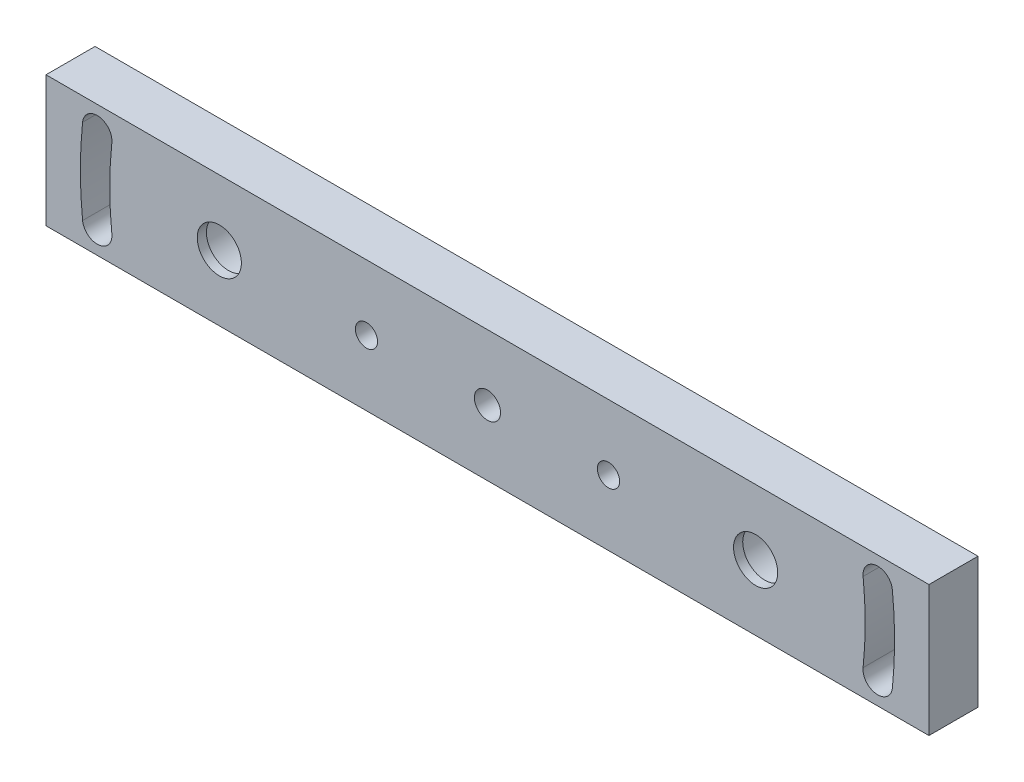
ISO-10303-21;
HEADER;
FILE_DESCRIPTION(('STEP AP214'),'2;1');
FILE_NAME('part.step','',(''),(''),'','','');
FILE_SCHEMA(('AUTOMOTIVE_DESIGN { 1 0 10303 214 1 1 1 1 }'));
ENDSEC;
DATA;
#1=APPLICATION_CONTEXT('core data for automotive mechanical design processes');
#2=APPLICATION_PROTOCOL_DEFINITION('international standard','automotive_design',2000,#1);
#3=PRODUCT_CONTEXT('',#1,'mechanical');
#4=PRODUCT('Part','Part','',(#3));
#5=PRODUCT_RELATED_PRODUCT_CATEGORY('part','',(#4));
#6=PRODUCT_DEFINITION_FORMATION('','',#4);
#7=PRODUCT_DEFINITION_CONTEXT('part definition',#1,'design');
#8=PRODUCT_DEFINITION('design','',#6,#7);
#9=PRODUCT_DEFINITION_SHAPE('','',#8);
#10=(LENGTH_UNIT() NAMED_UNIT(*) SI_UNIT(.MILLI.,.METRE.));
#11=(NAMED_UNIT(*) PLANE_ANGLE_UNIT() SI_UNIT($,.RADIAN.));
#12=(NAMED_UNIT(*) SI_UNIT($,.STERADIAN.) SOLID_ANGLE_UNIT());
#13=UNCERTAINTY_MEASURE_WITH_UNIT(LENGTH_MEASURE(1.E-05),#10,'distance_accuracy_value','');
#14=(GEOMETRIC_REPRESENTATION_CONTEXT(3) GLOBAL_UNCERTAINTY_ASSIGNED_CONTEXT((#13)) GLOBAL_UNIT_ASSIGNED_CONTEXT((#10,
#11,#12)) REPRESENTATION_CONTEXT('',''));
#15=CARTESIAN_POINT('',(0.,0.,0.));
#16=DIRECTION('',(0.,0.,1.));
#17=DIRECTION('',(1.,0.,0.));
#18=AXIS2_PLACEMENT_3D('',#15,#16,#17);
#19=CARTESIAN_POINT('',(0.,0.,15.));
#20=DIRECTION('',(0.,0.,-1.));
#21=DIRECTION('',(-1.,0.,0.));
#22=AXIS2_PLACEMENT_3D('',#19,#20,#21);
#23=PLANE('',#22);
#24=CARTESIAN_POINT('',(0.,0.,15.));
#25=DIRECTION('',(0.,0.,-1.));
#26=DIRECTION('',(-1.,0.,0.));
#27=AXIS2_PLACEMENT_3D('',#24,#25,#26);
#28=CIRCLE('',#27,4.00000000000001);
#29=CARTESIAN_POINT('',(-4.00000000000001,0.,15.));
#30=VERTEX_POINT('',#29);
#31=EDGE_CURVE('E486',#30,#30,#28,.T.);
#32=ORIENTED_EDGE('',*,*,#31,.T.);
#33=EDGE_LOOP('',(#32));
#34=FACE_BOUND('',#33,.T.);
#35=CARTESIAN_POINT('',(-37.,0.,15.));
#36=DIRECTION('',(0.,0.,1.));
#37=DIRECTION('',(1.,0.,0.));
#38=AXIS2_PLACEMENT_3D('',#35,#36,#37);
#39=CIRCLE('',#38,3.39999999999999);
#40=CARTESIAN_POINT('',(-33.6,0.,15.));
#41=VERTEX_POINT('',#40);
#42=EDGE_CURVE('E491',#41,#41,#39,.T.);
#43=ORIENTED_EDGE('',*,*,#42,.F.);
#44=EDGE_LOOP('',(#43));
#45=FACE_BOUND('',#44,.T.);
#46=DIRECTION('',(0.,1.,0.));
#47=VECTOR('',#46,1.);
#48=CARTESIAN_POINT('',(135.,-20.,15.));
#49=LINE('',#48,#47);
#50=CARTESIAN_POINT('',(135.,-20.,15.));
#51=VERTEX_POINT('',#50);
#52=CARTESIAN_POINT('',(135.,20.,15.));
#53=VERTEX_POINT('',#52);
#54=EDGE_CURVE('E222',#51,#53,#49,.T.);
#55=ORIENTED_EDGE('',*,*,#54,.T.);
#56=DIRECTION('',(-1.,0.,0.));
#57=VECTOR('',#56,1.);
#58=CARTESIAN_POINT('',(-135.,20.,15.));
#59=LINE('',#58,#57);
#60=CARTESIAN_POINT('',(-135.,20.,15.));
#61=VERTEX_POINT('',#60);
#62=EDGE_CURVE('E225',#53,#61,#59,.T.);
#63=ORIENTED_EDGE('',*,*,#62,.T.);
#64=DIRECTION('',(0.,-1.,0.));
#65=VECTOR('',#64,1.);
#66=CARTESIAN_POINT('',(-135.,-20.,15.));
#67=LINE('',#66,#65);
#68=CARTESIAN_POINT('',(-135.,-20.,15.));
#69=VERTEX_POINT('',#68);
#70=EDGE_CURVE('E228',#61,#69,#67,.T.);
#71=ORIENTED_EDGE('',*,*,#70,.T.);
#72=DIRECTION('',(1.,0.,0.));
#73=VECTOR('',#72,1.);
#74=CARTESIAN_POINT('',(-135.,-20.,15.));
#75=LINE('',#74,#73);
#76=EDGE_CURVE('E230',#69,#51,#75,.T.);
#77=ORIENTED_EDGE('',*,*,#76,.T.);
#78=EDGE_LOOP('',(#55,#63,#71,#77));
#79=FACE_BOUND('',#78,.T.);
#80=CARTESIAN_POINT('',(-82.,0.,15.));
#81=DIRECTION('',(0.,0.,-1.));
#82=DIRECTION('',(-1.,0.,0.));
#83=AXIS2_PLACEMENT_3D('',#80,#81,#82);
#84=CIRCLE('',#83,6.74999999999999);
#85=CARTESIAN_POINT('',(-88.75,0.,15.));
#86=VERTEX_POINT('',#85);
#87=EDGE_CURVE('E218',#86,#86,#84,.T.);
#88=ORIENTED_EDGE('',*,*,#87,.T.);
#89=EDGE_LOOP('',(#88));
#90=FACE_BOUND('',#89,.T.);
#91=CARTESIAN_POINT('',(82.,0.,15.));
#92=DIRECTION('',(0.,0.,-1.));
#93=DIRECTION('',(-1.,0.,0.));
#94=AXIS2_PLACEMENT_3D('',#91,#92,#93);
#95=CIRCLE('',#94,6.74999999999999);
#96=CARTESIAN_POINT('',(75.25,0.,15.));
#97=VERTEX_POINT('',#96);
#98=EDGE_CURVE('E206',#97,#97,#95,.T.);
#99=ORIENTED_EDGE('',*,*,#98,.T.);
#100=EDGE_LOOP('',(#99));
#101=FACE_BOUND('',#100,.T.);
#102=CARTESIAN_POINT('',(0.,0.,15.));
#103=DIRECTION('',(0.,0.,1.));
#104=DIRECTION('',(1.,0.,0.));
#105=AXIS2_PLACEMENT_3D('',#102,#103,#104);
#106=CIRCLE('',#105,124.5);
#107=CARTESIAN_POINT('',(123.81797597335,-13.013793676823,15.));
#108=VERTEX_POINT('',#107);
#109=CARTESIAN_POINT('',(123.81797597335,13.0137936768229,15.));
#110=VERTEX_POINT('',#109);
#111=EDGE_CURVE('E181',#108,#110,#106,.T.);
#112=ORIENTED_EDGE('',*,*,#111,.F.);
#113=CARTESIAN_POINT('',(119.342627444193,-12.5434155921184,15.));
#114=DIRECTION('',(0.,0.,1.));
#115=DIRECTION('',(1.,0.,0.));
#116=AXIS2_PLACEMENT_3D('',#113,#114,#115);
#117=CIRCLE('',#116,4.50000000000001);
#118=CARTESIAN_POINT('',(114.867278915036,-12.0730375074141,15.));
#119=VERTEX_POINT('',#118);
#120=EDGE_CURVE('E162',#119,#108,#117,.T.);
#121=ORIENTED_EDGE('',*,*,#120,.F.);
#122=CARTESIAN_POINT('',(0.,0.,15.));
#123=DIRECTION('',(0.,0.,-1.));
#124=DIRECTION('',(1.,0.,0.));
#125=AXIS2_PLACEMENT_3D('',#122,#123,#124);
#126=CIRCLE('',#125,115.5);
#127=CARTESIAN_POINT('',(114.867278915036,12.073037507414,15.));
#128=VERTEX_POINT('',#127);
#129=EDGE_CURVE('E170',#128,#119,#126,.T.);
#130=ORIENTED_EDGE('',*,*,#129,.F.);
#131=CARTESIAN_POINT('',(119.342627444193,12.5434155921184,15.));
#132=DIRECTION('',(0.,0.,1.));
#133=DIRECTION('',(1.,0.,0.));
#134=AXIS2_PLACEMENT_3D('',#131,#132,#133);
#135=CIRCLE('',#134,4.50000000000001);
#136=EDGE_CURVE('E184',#110,#128,#135,.T.);
#137=ORIENTED_EDGE('',*,*,#136,.F.);
#138=EDGE_LOOP('',(#112,#121,#130,#137));
#139=FACE_BOUND('',#138,.T.);
#140=CARTESIAN_POINT('',(-119.342627444193,12.5434155921184,15.));
#141=DIRECTION('',(0.,0.,1.));
#142=DIRECTION('',(-1.,0.,0.));
#143=AXIS2_PLACEMENT_3D('',#140,#141,#142);
#144=CIRCLE('',#143,4.50000000000001);
#145=CARTESIAN_POINT('',(-114.867278915036,12.073037507414,15.));
#146=VERTEX_POINT('',#145);
#147=CARTESIAN_POINT('',(-123.81797597335,13.0137936768229,15.));
#148=VERTEX_POINT('',#147);
#149=EDGE_CURVE('E156',#146,#148,#144,.T.);
#150=ORIENTED_EDGE('',*,*,#149,.F.);
#151=CARTESIAN_POINT('',(0.,0.,15.));
#152=DIRECTION('',(0.,0.,-1.));
#153=DIRECTION('',(-1.,0.,0.));
#154=AXIS2_PLACEMENT_3D('',#151,#152,#153);
#155=CIRCLE('',#154,115.5);
#156=CARTESIAN_POINT('',(-114.867278915036,-12.073037507414,15.));
#157=VERTEX_POINT('',#156);
#158=EDGE_CURVE('E52',#157,#146,#155,.T.);
#159=ORIENTED_EDGE('',*,*,#158,.F.);
#160=CARTESIAN_POINT('',(-119.342627444193,-12.5434155921184,15.));
#161=DIRECTION('',(0.,0.,1.));
#162=DIRECTION('',(-1.,0.,0.));
#163=AXIS2_PLACEMENT_3D('',#160,#161,#162);
#164=CIRCLE('',#163,4.50000000000001);
#165=CARTESIAN_POINT('',(-123.81797597335,-13.0137936768229,15.));
#166=VERTEX_POINT('',#165);
#167=EDGE_CURVE('E144',#166,#157,#164,.T.);
#168=ORIENTED_EDGE('',*,*,#167,.F.);
#169=CARTESIAN_POINT('',(0.,0.,15.));
#170=DIRECTION('',(0.,0.,1.));
#171=DIRECTION('',(-1.,0.,0.));
#172=AXIS2_PLACEMENT_3D('',#169,#170,#171);
#173=CIRCLE('',#172,124.5);
#174=EDGE_CURVE('E147',#148,#166,#173,.T.);
#175=ORIENTED_EDGE('',*,*,#174,.F.);
#176=EDGE_LOOP('',(#150,#159,#168,#175));
#177=FACE_BOUND('',#176,.T.);
#178=CARTESIAN_POINT('',(37.,0.,15.));
#179=DIRECTION('',(0.,0.,1.));
#180=DIRECTION('',(1.,0.,0.));
#181=AXIS2_PLACEMENT_3D('',#178,#179,#180);
#182=CIRCLE('',#181,3.39999999999999);
#183=CARTESIAN_POINT('',(40.4,0.,15.));
#184=VERTEX_POINT('',#183);
#185=EDGE_CURVE('E498',#184,#184,#182,.T.);
#186=ORIENTED_EDGE('',*,*,#185,.F.);
#187=EDGE_LOOP('',(#186));
#188=FACE_BOUND('',#187,.T.);
#189=ADVANCED_FACE('F37',(#34,#45,#79,#90,#101,#139,#177,#188),#23,.F.);
#190=CARTESIAN_POINT('',(135.,-20.,15.));
#191=DIRECTION('',(-1.,0.,0.));
#192=DIRECTION('',(0.,0.,1.));
#193=AXIS2_PLACEMENT_3D('',#190,#191,#192);
#194=PLANE('',#193);
#195=DIRECTION('',(0.,1.,0.));
#196=VECTOR('',#195,1.);
#197=CARTESIAN_POINT('',(135.,-20.,0.));
#198=LINE('',#197,#196);
#199=CARTESIAN_POINT('',(135.,-20.,0.));
#200=VERTEX_POINT('',#199);
#201=CARTESIAN_POINT('',(135.,20.,0.));
#202=VERTEX_POINT('',#201);
#203=EDGE_CURVE('E221',#200,#202,#198,.T.);
#204=ORIENTED_EDGE('',*,*,#203,.T.);
#205=DIRECTION('',(0.,0.,-1.));
#206=VECTOR('',#205,1.);
#207=CARTESIAN_POINT('',(135.,20.,15.));
#208=LINE('',#207,#206);
#209=EDGE_CURVE('E11',#53,#202,#208,.T.);
#210=ORIENTED_EDGE('',*,*,#209,.F.);
#211=ORIENTED_EDGE('',*,*,#54,.F.);
#212=DIRECTION('',(0.,0.,-1.));
#213=VECTOR('',#212,1.);
#214=CARTESIAN_POINT('',(135.,-20.,15.));
#215=LINE('',#214,#213);
#216=EDGE_CURVE('E232',#51,#200,#215,.T.);
#217=ORIENTED_EDGE('',*,*,#216,.T.);
#218=EDGE_LOOP('',(#204,#210,#211,#217));
#219=FACE_BOUND('',#218,.T.);
#220=ADVANCED_FACE('F39',(#219),#194,.F.);
#221=CARTESIAN_POINT('',(-135.,20.,15.));
#222=DIRECTION('',(0.,-1.,0.));
#223=DIRECTION('',(0.,0.,-1.));
#224=AXIS2_PLACEMENT_3D('',#221,#222,#223);
#225=PLANE('',#224);
#226=DIRECTION('',(-1.,0.,0.));
#227=VECTOR('',#226,1.);
#228=CARTESIAN_POINT('',(-135.,20.,0.));
#229=LINE('',#228,#227);
#230=CARTESIAN_POINT('',(-135.,20.,0.));
#231=VERTEX_POINT('',#230);
#232=EDGE_CURVE('E235',#202,#231,#229,.T.);
#233=ORIENTED_EDGE('',*,*,#232,.T.);
#234=DIRECTION('',(0.,0.,-1.));
#235=VECTOR('',#234,1.);
#236=CARTESIAN_POINT('',(-135.,20.,15.));
#237=LINE('',#236,#235);
#238=EDGE_CURVE('E45',#61,#231,#237,.T.);
#239=ORIENTED_EDGE('',*,*,#238,.F.);
#240=ORIENTED_EDGE('',*,*,#62,.F.);
#241=ORIENTED_EDGE('',*,*,#209,.T.);
#242=EDGE_LOOP('',(#233,#239,#240,#241));
#243=FACE_BOUND('',#242,.T.);
#244=ADVANCED_FACE('F264',(#243),#225,.F.);
#245=CARTESIAN_POINT('',(-135.,-20.,15.));
#246=DIRECTION('',(1.,0.,0.));
#247=DIRECTION('',(0.,0.,-1.));
#248=AXIS2_PLACEMENT_3D('',#245,#246,#247);
#249=PLANE('',#248);
#250=DIRECTION('',(0.,-1.,0.));
#251=VECTOR('',#250,1.);
#252=CARTESIAN_POINT('',(-135.,-20.,0.));
#253=LINE('',#252,#251);
#254=CARTESIAN_POINT('',(-135.,-20.,0.));
#255=VERTEX_POINT('',#254);
#256=EDGE_CURVE('E237',#231,#255,#253,.T.);
#257=ORIENTED_EDGE('',*,*,#256,.T.);
#258=DIRECTION('',(0.,0.,-1.));
#259=VECTOR('',#258,1.);
#260=CARTESIAN_POINT('',(-135.,-20.,15.));
#261=LINE('',#260,#259);
#262=EDGE_CURVE('E242',#69,#255,#261,.T.);
#263=ORIENTED_EDGE('',*,*,#262,.F.);
#264=ORIENTED_EDGE('',*,*,#70,.F.);
#265=ORIENTED_EDGE('',*,*,#238,.T.);
#266=EDGE_LOOP('',(#257,#263,#264,#265));
#267=FACE_BOUND('',#266,.T.);
#268=ADVANCED_FACE('F249',(#267),#249,.F.);
#269=CARTESIAN_POINT('',(-135.,-20.,15.));
#270=DIRECTION('',(0.,1.,0.));
#271=DIRECTION('',(0.,0.,1.));
#272=AXIS2_PLACEMENT_3D('',#269,#270,#271);
#273=PLANE('',#272);
#274=DIRECTION('',(1.,0.,0.));
#275=VECTOR('',#274,1.);
#276=CARTESIAN_POINT('',(-135.,-20.,0.));
#277=LINE('',#276,#275);
#278=EDGE_CURVE('E226',#255,#200,#277,.T.);
#279=ORIENTED_EDGE('',*,*,#278,.T.);
#280=ORIENTED_EDGE('',*,*,#216,.F.);
#281=ORIENTED_EDGE('',*,*,#76,.F.);
#282=ORIENTED_EDGE('',*,*,#262,.T.);
#283=EDGE_LOOP('',(#279,#280,#281,#282));
#284=FACE_BOUND('',#283,.T.);
#285=ADVANCED_FACE('F257',(#284),#273,.F.);
#286=CARTESIAN_POINT('',(0.,0.,0.));
#287=DIRECTION('',(0.,0.,-1.));
#288=DIRECTION('',(-1.,0.,0.));
#289=AXIS2_PLACEMENT_3D('',#286,#287,#288);
#290=PLANE('',#289);
#291=CARTESIAN_POINT('',(0.,0.,0.));
#292=DIRECTION('',(0.,0.,-1.));
#293=DIRECTION('',(-1.,0.,0.));
#294=AXIS2_PLACEMENT_3D('',#291,#292,#293);
#295=CIRCLE('',#294,4.00000000000001);
#296=CARTESIAN_POINT('',(-4.00000000000001,0.,0.));
#297=VERTEX_POINT('',#296);
#298=EDGE_CURVE('E489',#297,#297,#295,.T.);
#299=ORIENTED_EDGE('',*,*,#298,.F.);
#300=EDGE_LOOP('',(#299));
#301=FACE_BOUND('',#300,.T.);
#302=CARTESIAN_POINT('',(-37.,0.,0.));
#303=DIRECTION('',(0.,0.,1.));
#304=DIRECTION('',(1.,0.,0.));
#305=AXIS2_PLACEMENT_3D('',#302,#303,#304);
#306=CIRCLE('',#305,3.4);
#307=CARTESIAN_POINT('',(-33.6,0.,0.));
#308=VERTEX_POINT('',#307);
#309=EDGE_CURVE('E496',#308,#308,#306,.T.);
#310=ORIENTED_EDGE('',*,*,#309,.T.);
#311=EDGE_LOOP('',(#310));
#312=FACE_BOUND('',#311,.T.);
#313=CARTESIAN_POINT('',(37.,0.,0.));
#314=DIRECTION('',(0.,0.,1.));
#315=DIRECTION('',(1.,0.,0.));
#316=AXIS2_PLACEMENT_3D('',#313,#314,#315);
#317=CIRCLE('',#316,3.4);
#318=CARTESIAN_POINT('',(40.4,0.,0.));
#319=VERTEX_POINT('',#318);
#320=EDGE_CURVE('E150',#319,#319,#317,.T.);
#321=ORIENTED_EDGE('',*,*,#320,.T.);
#322=EDGE_LOOP('',(#321));
#323=FACE_BOUND('',#322,.T.);
#324=CARTESIAN_POINT('',(0.,0.,0.));
#325=DIRECTION('',(0.,0.,-1.));
#326=DIRECTION('',(-1.,0.,0.));
#327=AXIS2_PLACEMENT_3D('',#324,#325,#326);
#328=CIRCLE('',#327,115.5);
#329=CARTESIAN_POINT('',(-114.867278915036,-12.073037507414,0.));
#330=VERTEX_POINT('',#329);
#331=CARTESIAN_POINT('',(-114.867278915036,12.073037507414,0.));
#332=VERTEX_POINT('',#331);
#333=EDGE_CURVE('E128',#330,#332,#328,.T.);
#334=ORIENTED_EDGE('',*,*,#333,.T.);
#335=CARTESIAN_POINT('',(-119.342627444193,12.5434155921184,0.));
#336=DIRECTION('',(0.,0.,1.));
#337=DIRECTION('',(-1.,0.,0.));
#338=AXIS2_PLACEMENT_3D('',#335,#336,#337);
#339=CIRCLE('',#338,4.50000000000001);
#340=CARTESIAN_POINT('',(-123.81797597335,13.0137936768229,0.));
#341=VERTEX_POINT('',#340);
#342=EDGE_CURVE('E137',#332,#341,#339,.T.);
#343=ORIENTED_EDGE('',*,*,#342,.T.);
#344=CARTESIAN_POINT('',(0.,0.,0.));
#345=DIRECTION('',(0.,0.,1.));
#346=DIRECTION('',(-1.,0.,0.));
#347=AXIS2_PLACEMENT_3D('',#344,#345,#346);
#348=CIRCLE('',#347,124.5);
#349=CARTESIAN_POINT('',(-123.81797597335,-13.0137936768229,0.));
#350=VERTEX_POINT('',#349);
#351=EDGE_CURVE('E60',#341,#350,#348,.T.);
#352=ORIENTED_EDGE('',*,*,#351,.T.);
#353=CARTESIAN_POINT('',(-119.342627444193,-12.5434155921184,0.));
#354=DIRECTION('',(0.,0.,1.));
#355=DIRECTION('',(-1.,0.,0.));
#356=AXIS2_PLACEMENT_3D('',#353,#354,#355);
#357=CIRCLE('',#356,4.50000000000001);
#358=EDGE_CURVE('E134',#350,#330,#357,.T.);
#359=ORIENTED_EDGE('',*,*,#358,.T.);
#360=EDGE_LOOP('',(#334,#343,#352,#359));
#361=FACE_BOUND('',#360,.T.);
#362=CARTESIAN_POINT('',(119.342627444193,-12.5434155921184,0.));
#363=DIRECTION('',(0.,0.,1.));
#364=DIRECTION('',(1.,0.,0.));
#365=AXIS2_PLACEMENT_3D('',#362,#363,#364);
#366=CIRCLE('',#365,4.50000000000001);
#367=CARTESIAN_POINT('',(114.867278915036,-12.0730375074141,0.));
#368=VERTEX_POINT('',#367);
#369=CARTESIAN_POINT('',(123.81797597335,-13.013793676823,0.));
#370=VERTEX_POINT('',#369);
#371=EDGE_CURVE('E166',#368,#370,#366,.T.);
#372=ORIENTED_EDGE('',*,*,#371,.T.);
#373=CARTESIAN_POINT('',(0.,0.,0.));
#374=DIRECTION('',(0.,0.,1.));
#375=DIRECTION('',(1.,0.,0.));
#376=AXIS2_PLACEMENT_3D('',#373,#374,#375);
#377=CIRCLE('',#376,124.5);
#378=CARTESIAN_POINT('',(123.81797597335,13.0137936768229,0.));
#379=VERTEX_POINT('',#378);
#380=EDGE_CURVE('E169',#370,#379,#377,.T.);
#381=ORIENTED_EDGE('',*,*,#380,.T.);
#382=CARTESIAN_POINT('',(119.342627444193,12.5434155921184,0.));
#383=DIRECTION('',(0.,0.,1.));
#384=DIRECTION('',(1.,0.,0.));
#385=AXIS2_PLACEMENT_3D('',#382,#383,#384);
#386=CIRCLE('',#385,4.50000000000001);
#387=CARTESIAN_POINT('',(114.867278915036,12.073037507414,0.));
#388=VERTEX_POINT('',#387);
#389=EDGE_CURVE('E173',#379,#388,#386,.T.);
#390=ORIENTED_EDGE('',*,*,#389,.T.);
#391=CARTESIAN_POINT('',(0.,0.,0.));
#392=DIRECTION('',(0.,0.,-1.));
#393=DIRECTION('',(1.,0.,0.));
#394=AXIS2_PLACEMENT_3D('',#391,#392,#393);
#395=CIRCLE('',#394,115.5);
#396=EDGE_CURVE('E176',#388,#368,#395,.T.);
#397=ORIENTED_EDGE('',*,*,#396,.T.);
#398=EDGE_LOOP('',(#372,#381,#390,#397));
#399=FACE_BOUND('',#398,.T.);
#400=CARTESIAN_POINT('',(82.,0.,0.));
#401=DIRECTION('',(0.,0.,-1.));
#402=DIRECTION('',(-1.,0.,0.));
#403=AXIS2_PLACEMENT_3D('',#400,#401,#402);
#404=CIRCLE('',#403,9.99999999999999);
#405=CARTESIAN_POINT('',(72.,0.,0.));
#406=VERTEX_POINT('',#405);
#407=EDGE_CURVE('E191',#406,#406,#404,.T.);
#408=ORIENTED_EDGE('',*,*,#407,.F.);
#409=EDGE_LOOP('',(#408));
#410=FACE_BOUND('',#409,.T.);
#411=CARTESIAN_POINT('',(-82.,0.,0.));
#412=DIRECTION('',(0.,0.,-1.));
#413=DIRECTION('',(-1.,0.,0.));
#414=AXIS2_PLACEMENT_3D('',#411,#412,#413);
#415=CIRCLE('',#414,9.99999999999999);
#416=CARTESIAN_POINT('',(-92.,0.,0.));
#417=VERTEX_POINT('',#416);
#418=EDGE_CURVE('E209',#417,#417,#415,.T.);
#419=ORIENTED_EDGE('',*,*,#418,.F.);
#420=EDGE_LOOP('',(#419));
#421=FACE_BOUND('',#420,.T.);
#422=ORIENTED_EDGE('',*,*,#203,.F.);
#423=ORIENTED_EDGE('',*,*,#278,.F.);
#424=ORIENTED_EDGE('',*,*,#256,.F.);
#425=ORIENTED_EDGE('',*,*,#232,.F.);
#426=EDGE_LOOP('',(#422,#423,#424,#425));
#427=FACE_BOUND('',#426,.T.);
#428=ADVANCED_FACE('F141',(#301,#312,#323,#361,#399,#410,#421,#427),#290,.T.);
#429=CARTESIAN_POINT('',(-82.,0.,0.));
#430=DIRECTION('',(0.,0.,-1.));
#431=DIRECTION('',(-1.,0.,0.));
#432=AXIS2_PLACEMENT_3D('',#429,#430,#431);
#433=CYLINDRICAL_SURFACE('',#432,6.74999999999999);
#434=ORIENTED_EDGE('',*,*,#87,.F.);
#435=EDGE_LOOP('',(#434));
#436=FACE_BOUND('',#435,.T.);
#437=CARTESIAN_POINT('',(-82.,0.,12.2));
#438=DIRECTION('',(0.,0.,-1.));
#439=DIRECTION('',(-1.,0.,0.));
#440=AXIS2_PLACEMENT_3D('',#437,#438,#439);
#441=CIRCLE('',#440,6.74999999999999);
#442=CARTESIAN_POINT('',(-88.75,0.,12.2));
#443=VERTEX_POINT('',#442);
#444=EDGE_CURVE('E215',#443,#443,#441,.T.);
#445=ORIENTED_EDGE('',*,*,#444,.T.);
#446=EDGE_LOOP('',(#445));
#447=FACE_BOUND('',#446,.T.);
#448=ADVANCED_FACE('F280',(#436,#447),#433,.F.);
#449=CARTESIAN_POINT('',(-75.25,0.,12.2));
#450=DIRECTION('',(0.,0.,1.));
#451=DIRECTION('',(1.,0.,0.));
#452=AXIS2_PLACEMENT_3D('',#449,#450,#451);
#453=PLANE('',#452);
#454=ORIENTED_EDGE('',*,*,#444,.F.);
#455=EDGE_LOOP('',(#454));
#456=FACE_BOUND('',#455,.T.);
#457=CARTESIAN_POINT('',(-82.,0.,12.2));
#458=DIRECTION('',(0.,0.,-1.));
#459=DIRECTION('',(-1.,0.,0.));
#460=AXIS2_PLACEMENT_3D('',#457,#458,#459);
#461=CIRCLE('',#460,9.99999999999999);
#462=CARTESIAN_POINT('',(-92.,0.,12.2));
#463=VERTEX_POINT('',#462);
#464=EDGE_CURVE('E212',#463,#463,#461,.T.);
#465=ORIENTED_EDGE('',*,*,#464,.T.);
#466=EDGE_LOOP('',(#465));
#467=FACE_BOUND('',#466,.T.);
#468=ADVANCED_FACE('F301',(#456,#467),#453,.F.);
#469=CARTESIAN_POINT('',(-82.,0.,0.));
#470=DIRECTION('',(0.,0.,-1.));
#471=DIRECTION('',(-1.,0.,0.));
#472=AXIS2_PLACEMENT_3D('',#469,#470,#471);
#473=CYLINDRICAL_SURFACE('',#472,9.99999999999999);
#474=ORIENTED_EDGE('',*,*,#464,.F.);
#475=EDGE_LOOP('',(#474));
#476=FACE_BOUND('',#475,.T.);
#477=ORIENTED_EDGE('',*,*,#418,.T.);
#478=EDGE_LOOP('',(#477));
#479=FACE_BOUND('',#478,.T.);
#480=ADVANCED_FACE('F308',(#476,#479),#473,.F.);
#481=CARTESIAN_POINT('',(82.,0.,0.));
#482=DIRECTION('',(0.,0.,-1.));
#483=DIRECTION('',(-1.,0.,0.));
#484=AXIS2_PLACEMENT_3D('',#481,#482,#483);
#485=CYLINDRICAL_SURFACE('',#484,6.74999999999999);
#486=ORIENTED_EDGE('',*,*,#98,.F.);
#487=EDGE_LOOP('',(#486));
#488=FACE_BOUND('',#487,.T.);
#489=CARTESIAN_POINT('',(82.,0.,12.2));
#490=DIRECTION('',(0.,0.,-1.));
#491=DIRECTION('',(-1.,0.,0.));
#492=AXIS2_PLACEMENT_3D('',#489,#490,#491);
#493=CIRCLE('',#492,6.74999999999999);
#494=CARTESIAN_POINT('',(75.25,0.,12.2));
#495=VERTEX_POINT('',#494);
#496=EDGE_CURVE('E203',#495,#495,#493,.T.);
#497=ORIENTED_EDGE('',*,*,#496,.T.);
#498=EDGE_LOOP('',(#497));
#499=FACE_BOUND('',#498,.T.);
#500=ADVANCED_FACE('F315',(#488,#499),#485,.F.);
#501=CARTESIAN_POINT('',(88.75,0.,12.2));
#502=DIRECTION('',(0.,0.,1.));
#503=DIRECTION('',(1.,0.,0.));
#504=AXIS2_PLACEMENT_3D('',#501,#502,#503);
#505=PLANE('',#504);
#506=ORIENTED_EDGE('',*,*,#496,.F.);
#507=EDGE_LOOP('',(#506));
#508=FACE_BOUND('',#507,.T.);
#509=CARTESIAN_POINT('',(82.,0.,12.2));
#510=DIRECTION('',(0.,0.,-1.));
#511=DIRECTION('',(-1.,0.,0.));
#512=AXIS2_PLACEMENT_3D('',#509,#510,#511);
#513=CIRCLE('',#512,9.99999999999999);
#514=CARTESIAN_POINT('',(72.,0.,12.2));
#515=VERTEX_POINT('',#514);
#516=EDGE_CURVE('E200',#515,#515,#513,.T.);
#517=ORIENTED_EDGE('',*,*,#516,.T.);
#518=EDGE_LOOP('',(#517));
#519=FACE_BOUND('',#518,.T.);
#520=ADVANCED_FACE('F323',(#508,#519),#505,.F.);
#521=CARTESIAN_POINT('',(82.,0.,0.));
#522=DIRECTION('',(0.,0.,-1.));
#523=DIRECTION('',(-1.,0.,0.));
#524=AXIS2_PLACEMENT_3D('',#521,#522,#523);
#525=CYLINDRICAL_SURFACE('',#524,9.99999999999999);
#526=ORIENTED_EDGE('',*,*,#516,.F.);
#527=EDGE_LOOP('',(#526));
#528=FACE_BOUND('',#527,.T.);
#529=ORIENTED_EDGE('',*,*,#407,.T.);
#530=EDGE_LOOP('',(#529));
#531=FACE_BOUND('',#530,.T.);
#532=ADVANCED_FACE('F331',(#528,#531),#525,.F.);
#533=CARTESIAN_POINT('',(119.342627444193,-12.5434155921184,0.));
#534=DIRECTION('',(0.,0.,1.));
#535=DIRECTION('',(1.,0.,0.));
#536=AXIS2_PLACEMENT_3D('',#533,#534,#535);
#537=CYLINDRICAL_SURFACE('',#536,4.50000000000001);
#538=ORIENTED_EDGE('',*,*,#120,.T.);
#539=DIRECTION('',(0.,0.,1.));
#540=VECTOR('',#539,1.);
#541=CARTESIAN_POINT('',(123.81797597335,-13.013793676823,0.));
#542=LINE('',#541,#540);
#543=EDGE_CURVE('E179',#370,#108,#542,.T.);
#544=ORIENTED_EDGE('',*,*,#543,.F.);
#545=ORIENTED_EDGE('',*,*,#371,.F.);
#546=DIRECTION('',(0.,0.,1.));
#547=VECTOR('',#546,1.);
#548=CARTESIAN_POINT('',(114.867278915036,-12.0730375074141,0.));
#549=LINE('',#548,#547);
#550=EDGE_CURVE('E189',#368,#119,#549,.T.);
#551=ORIENTED_EDGE('',*,*,#550,.T.);
#552=EDGE_LOOP('',(#538,#544,#545,#551));
#553=FACE_BOUND('',#552,.T.);
#554=ADVANCED_FACE('F339',(#553),#537,.F.);
#555=CARTESIAN_POINT('',(0.,0.,0.));
#556=DIRECTION('',(0.,0.,1.));
#557=DIRECTION('',(1.,0.,0.));
#558=AXIS2_PLACEMENT_3D('',#555,#556,#557);
#559=CYLINDRICAL_SURFACE('',#558,115.5);
#560=ORIENTED_EDGE('',*,*,#129,.T.);
#561=ORIENTED_EDGE('',*,*,#550,.F.);
#562=ORIENTED_EDGE('',*,*,#396,.F.);
#563=DIRECTION('',(0.,0.,1.));
#564=VECTOR('',#563,1.);
#565=CARTESIAN_POINT('',(114.867278915036,12.073037507414,0.));
#566=LINE('',#565,#564);
#567=EDGE_CURVE('E192',#388,#128,#566,.T.);
#568=ORIENTED_EDGE('',*,*,#567,.T.);
#569=EDGE_LOOP('',(#560,#561,#562,#568));
#570=FACE_BOUND('',#569,.T.);
#571=ADVANCED_FACE('F347',(#570),#559,.T.);
#572=CARTESIAN_POINT('',(119.342627444193,12.5434155921184,0.));
#573=DIRECTION('',(0.,0.,1.));
#574=DIRECTION('',(1.,0.,0.));
#575=AXIS2_PLACEMENT_3D('',#572,#573,#574);
#576=CYLINDRICAL_SURFACE('',#575,4.50000000000001);
#577=ORIENTED_EDGE('',*,*,#136,.T.);
#578=ORIENTED_EDGE('',*,*,#567,.F.);
#579=ORIENTED_EDGE('',*,*,#389,.F.);
#580=DIRECTION('',(0.,0.,1.));
#581=VECTOR('',#580,1.);
#582=CARTESIAN_POINT('',(123.81797597335,13.0137936768229,0.));
#583=LINE('',#582,#581);
#584=EDGE_CURVE('E194',#379,#110,#583,.T.);
#585=ORIENTED_EDGE('',*,*,#584,.T.);
#586=EDGE_LOOP('',(#577,#578,#579,#585));
#587=FACE_BOUND('',#586,.T.);
#588=ADVANCED_FACE('F355',(#587),#576,.F.);
#589=CARTESIAN_POINT('',(0.,0.,0.));
#590=DIRECTION('',(0.,0.,1.));
#591=DIRECTION('',(1.,0.,0.));
#592=AXIS2_PLACEMENT_3D('',#589,#590,#591);
#593=CYLINDRICAL_SURFACE('',#592,124.5);
#594=ORIENTED_EDGE('',*,*,#111,.T.);
#595=ORIENTED_EDGE('',*,*,#584,.F.);
#596=ORIENTED_EDGE('',*,*,#380,.F.);
#597=ORIENTED_EDGE('',*,*,#543,.T.);
#598=EDGE_LOOP('',(#594,#595,#596,#597));
#599=FACE_BOUND('',#598,.T.);
#600=ADVANCED_FACE('F363',(#599),#593,.F.);
#601=CARTESIAN_POINT('',(0.,0.,0.));
#602=DIRECTION('',(0.,0.,1.));
#603=DIRECTION('',(1.,0.,0.));
#604=AXIS2_PLACEMENT_3D('',#601,#602,#603);
#605=CYLINDRICAL_SURFACE('',#604,115.5);
#606=ORIENTED_EDGE('',*,*,#158,.T.);
#607=DIRECTION('',(0.,0.,1.));
#608=VECTOR('',#607,1.);
#609=CARTESIAN_POINT('',(-114.867278915036,12.073037507414,0.));
#610=LINE('',#609,#608);
#611=EDGE_CURVE('E124',#332,#146,#610,.T.);
#612=ORIENTED_EDGE('',*,*,#611,.F.);
#613=ORIENTED_EDGE('',*,*,#333,.F.);
#614=DIRECTION('',(0.,0.,1.));
#615=VECTOR('',#614,1.);
#616=CARTESIAN_POINT('',(-114.867278915036,-12.073037507414,0.));
#617=LINE('',#616,#615);
#618=EDGE_CURVE('E160',#330,#157,#617,.T.);
#619=ORIENTED_EDGE('',*,*,#618,.T.);
#620=EDGE_LOOP('',(#606,#612,#613,#619));
#621=FACE_BOUND('',#620,.T.);
#622=ADVANCED_FACE('F126',(#621),#605,.T.);
#623=CARTESIAN_POINT('',(-119.342627444193,-12.5434155921184,0.));
#624=DIRECTION('',(0.,0.,1.));
#625=DIRECTION('',(1.,0.,0.));
#626=AXIS2_PLACEMENT_3D('',#623,#624,#625);
#627=CYLINDRICAL_SURFACE('',#626,4.50000000000001);
#628=ORIENTED_EDGE('',*,*,#167,.T.);
#629=ORIENTED_EDGE('',*,*,#618,.F.);
#630=ORIENTED_EDGE('',*,*,#358,.F.);
#631=DIRECTION('',(0.,0.,1.));
#632=VECTOR('',#631,1.);
#633=CARTESIAN_POINT('',(-123.81797597335,-13.0137936768229,0.));
#634=LINE('',#633,#632);
#635=EDGE_CURVE('E163',#350,#166,#634,.T.);
#636=ORIENTED_EDGE('',*,*,#635,.T.);
#637=EDGE_LOOP('',(#628,#629,#630,#636));
#638=FACE_BOUND('',#637,.T.);
#639=ADVANCED_FACE('F378',(#638),#627,.F.);
#640=CARTESIAN_POINT('',(0.,0.,0.));
#641=DIRECTION('',(0.,0.,1.));
#642=DIRECTION('',(1.,0.,0.));
#643=AXIS2_PLACEMENT_3D('',#640,#641,#642);
#644=CYLINDRICAL_SURFACE('',#643,124.5);
#645=ORIENTED_EDGE('',*,*,#174,.T.);
#646=ORIENTED_EDGE('',*,*,#635,.F.);
#647=ORIENTED_EDGE('',*,*,#351,.F.);
#648=DIRECTION('',(0.,0.,1.));
#649=VECTOR('',#648,1.);
#650=CARTESIAN_POINT('',(-123.81797597335,13.0137936768229,0.));
#651=LINE('',#650,#649);
#652=EDGE_CURVE('E133',#341,#148,#651,.T.);
#653=ORIENTED_EDGE('',*,*,#652,.T.);
#654=EDGE_LOOP('',(#645,#646,#647,#653));
#655=FACE_BOUND('',#654,.T.);
#656=ADVANCED_FACE('F385',(#655),#644,.F.);
#657=CARTESIAN_POINT('',(-119.342627444193,12.5434155921184,0.));
#658=DIRECTION('',(0.,0.,1.));
#659=DIRECTION('',(1.,0.,0.));
#660=AXIS2_PLACEMENT_3D('',#657,#658,#659);
#661=CYLINDRICAL_SURFACE('',#660,4.50000000000001);
#662=ORIENTED_EDGE('',*,*,#149,.T.);
#663=ORIENTED_EDGE('',*,*,#652,.F.);
#664=ORIENTED_EDGE('',*,*,#342,.F.);
#665=ORIENTED_EDGE('',*,*,#611,.T.);
#666=EDGE_LOOP('',(#662,#663,#664,#665));
#667=FACE_BOUND('',#666,.T.);
#668=ADVANCED_FACE('F138',(#667),#661,.F.);
#669=CARTESIAN_POINT('',(37.,0.,15.));
#670=DIRECTION('',(0.,0.,1.));
#671=DIRECTION('',(1.,0.,0.));
#672=AXIS2_PLACEMENT_3D('',#669,#670,#671);
#673=CYLINDRICAL_SURFACE('',#672,3.39999999999999);
#674=ORIENTED_EDGE('',*,*,#320,.F.);
#675=EDGE_LOOP('',(#674));
#676=FACE_BOUND('',#675,.T.);
#677=ORIENTED_EDGE('',*,*,#185,.T.);
#678=EDGE_LOOP('',(#677));
#679=FACE_BOUND('',#678,.T.);
#680=ADVANCED_FACE('F399',(#676,#679),#673,.F.);
#681=CARTESIAN_POINT('',(-37.,0.,15.));
#682=DIRECTION('',(0.,0.,1.));
#683=DIRECTION('',(1.,0.,0.));
#684=AXIS2_PLACEMENT_3D('',#681,#682,#683);
#685=CYLINDRICAL_SURFACE('',#684,3.39999999999999);
#686=ORIENTED_EDGE('',*,*,#309,.F.);
#687=EDGE_LOOP('',(#686));
#688=FACE_BOUND('',#687,.T.);
#689=ORIENTED_EDGE('',*,*,#42,.T.);
#690=EDGE_LOOP('',(#689));
#691=FACE_BOUND('',#690,.T.);
#692=ADVANCED_FACE('F407',(#688,#691),#685,.F.);
#693=CARTESIAN_POINT('',(0.,0.,0.));
#694=DIRECTION('',(0.,0.,-1.));
#695=DIRECTION('',(-1.,0.,0.));
#696=AXIS2_PLACEMENT_3D('',#693,#694,#695);
#697=CYLINDRICAL_SURFACE('',#696,4.00000000000001);
#698=ORIENTED_EDGE('',*,*,#31,.F.);
#699=EDGE_LOOP('',(#698));
#700=FACE_BOUND('',#699,.T.);
#701=ORIENTED_EDGE('',*,*,#298,.T.);
#702=EDGE_LOOP('',(#701));
#703=FACE_BOUND('',#702,.T.);
#704=ADVANCED_FACE('F414',(#700,#703),#697,.F.);
#705=CLOSED_SHELL('',(#189,#220,#244,#268,#285,#428,#448,#468,#480,#500,#520,#532,#554,#571,
#588,#600,#622,#639,#656,#668,#680,#692,#704));
#706=MANIFOLD_SOLID_BREP('B2',#705);
#707=ADVANCED_BREP_SHAPE_REPRESENTATION('',(#18,#706),#14);
#708=SHAPE_DEFINITION_REPRESENTATION(#9,#707);
ENDSEC;
END-ISO-10303-21;
